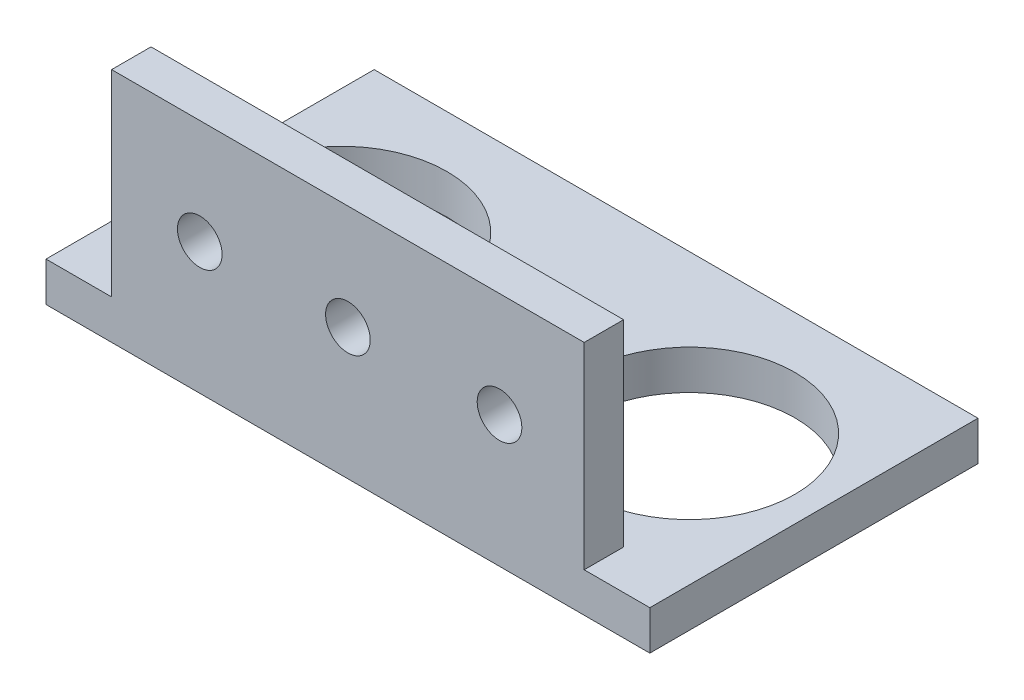
ISO-10303-21;
HEADER;
FILE_DESCRIPTION(('STEP AP214'),'2;1');
FILE_NAME('part.step','',(''),(''),'','','');
FILE_SCHEMA(('AUTOMOTIVE_DESIGN { 1 0 10303 214 1 1 1 1 }'));
ENDSEC;
DATA;
#1=APPLICATION_CONTEXT('core data for automotive mechanical design processes');
#2=APPLICATION_PROTOCOL_DEFINITION('international standard','automotive_design',2000,#1);
#3=PRODUCT_CONTEXT('',#1,'mechanical');
#4=PRODUCT('Part','Part','',(#3));
#5=PRODUCT_RELATED_PRODUCT_CATEGORY('part','',(#4));
#6=PRODUCT_DEFINITION_FORMATION('','',#4);
#7=PRODUCT_DEFINITION_CONTEXT('part definition',#1,'design');
#8=PRODUCT_DEFINITION('design','',#6,#7);
#9=PRODUCT_DEFINITION_SHAPE('','',#8);
#10=(LENGTH_UNIT() NAMED_UNIT(*) SI_UNIT(.MILLI.,.METRE.));
#11=(NAMED_UNIT(*) PLANE_ANGLE_UNIT() SI_UNIT($,.RADIAN.));
#12=(NAMED_UNIT(*) SI_UNIT($,.STERADIAN.) SOLID_ANGLE_UNIT());
#13=UNCERTAINTY_MEASURE_WITH_UNIT(LENGTH_MEASURE(1.E-05),#10,'distance_accuracy_value','');
#14=(GEOMETRIC_REPRESENTATION_CONTEXT(3) GLOBAL_UNCERTAINTY_ASSIGNED_CONTEXT((#13)) GLOBAL_UNIT_ASSIGNED_CONTEXT((#10,
#11,#12)) REPRESENTATION_CONTEXT('',''));
#15=CARTESIAN_POINT('',(0.,0.,0.));
#16=DIRECTION('',(0.,0.,1.));
#17=DIRECTION('',(1.,0.,0.));
#18=AXIS2_PLACEMENT_3D('',#15,#16,#17);
#19=CARTESIAN_POINT('',(-23.,18.,9.5));
#20=DIRECTION('',(0.,0.,1.));
#21=DIRECTION('',(1.,0.,0.));
#22=AXIS2_PLACEMENT_3D('',#19,#20,#21);
#23=PLANE('',#22);
#24=CARTESIAN_POINT('',(11.5475406188479,10.0060357357329,9.5));
#25=DIRECTION('',(0.,0.,-1.));
#26=DIRECTION('',(-1.,0.,0.));
#27=AXIS2_PLACEMENT_3D('',#24,#25,#26);
#28=CIRCLE('',#27,1.725);
#29=CARTESIAN_POINT('',(9.8225406188479,10.0060357357329,9.5));
#30=VERTEX_POINT('',#29);
#31=EDGE_CURVE('E209',#30,#30,#28,.T.);
#32=ORIENTED_EDGE('',*,*,#31,.F.);
#33=EDGE_LOOP('',(#32));
#34=FACE_BOUND('',#33,.T.);
#35=CARTESIAN_POINT('',(0.,10.0060357357329,9.5));
#36=DIRECTION('',(0.,0.,-1.));
#37=DIRECTION('',(-1.,0.,0.));
#38=AXIS2_PLACEMENT_3D('',#35,#36,#37);
#39=CIRCLE('',#38,1.725);
#40=CARTESIAN_POINT('',(-1.725,10.0060357357329,9.5));
#41=VERTEX_POINT('',#40);
#42=EDGE_CURVE('E221',#41,#41,#39,.T.);
#43=ORIENTED_EDGE('',*,*,#42,.F.);
#44=EDGE_LOOP('',(#43));
#45=FACE_BOUND('',#44,.T.);
#46=CARTESIAN_POINT('',(-11.2850965138741,10.0060357357329,9.5));
#47=DIRECTION('',(0.,0.,-1.));
#48=DIRECTION('',(-1.,0.,0.));
#49=AXIS2_PLACEMENT_3D('',#46,#47,#48);
#50=CIRCLE('',#49,1.725);
#51=CARTESIAN_POINT('',(-13.0100965138741,10.0060357357329,9.5));
#52=VERTEX_POINT('',#51);
#53=EDGE_CURVE('E233',#52,#52,#50,.T.);
#54=ORIENTED_EDGE('',*,*,#53,.F.);
#55=EDGE_LOOP('',(#54));
#56=FACE_BOUND('',#55,.T.);
#57=DIRECTION('',(0.,-1.,0.));
#58=VECTOR('',#57,1.);
#59=CARTESIAN_POINT('',(18.,18.,9.5));
#60=LINE('',#59,#58);
#61=CARTESIAN_POINT('',(18.,18.,9.5));
#62=VERTEX_POINT('',#61);
#63=CARTESIAN_POINT('',(18.,3.,9.5));
#64=VERTEX_POINT('',#63);
#65=EDGE_CURVE('E250',#62,#64,#60,.T.);
#66=ORIENTED_EDGE('',*,*,#65,.T.);
#67=DIRECTION('',(-1.,0.,0.));
#68=VECTOR('',#67,1.);
#69=CARTESIAN_POINT('',(-23.,3.,9.5));
#70=LINE('',#69,#68);
#71=CARTESIAN_POINT('',(-18.,3.,9.5));
#72=VERTEX_POINT('',#71);
#73=EDGE_CURVE('E266',#64,#72,#70,.T.);
#74=ORIENTED_EDGE('',*,*,#73,.T.);
#75=DIRECTION('',(0.,-1.,0.));
#76=VECTOR('',#75,1.);
#77=CARTESIAN_POINT('',(-18.,18.,9.5));
#78=LINE('',#77,#76);
#79=CARTESIAN_POINT('',(-18.,18.,9.5));
#80=VERTEX_POINT('',#79);
#81=EDGE_CURVE('E270',#80,#72,#78,.T.);
#82=ORIENTED_EDGE('',*,*,#81,.F.);
#83=DIRECTION('',(-1.,0.,0.));
#84=VECTOR('',#83,1.);
#85=CARTESIAN_POINT('',(-23.,18.,9.5));
#86=LINE('',#85,#84);
#87=EDGE_CURVE('E285',#62,#80,#86,.T.);
#88=ORIENTED_EDGE('',*,*,#87,.F.);
#89=EDGE_LOOP('',(#66,#74,#82,#88));
#90=FACE_BOUND('',#89,.T.);
#91=ADVANCED_FACE('F75',(#34,#45,#56,#90),#23,.F.);
#92=CARTESIAN_POINT('',(0.,18.,0.));
#93=DIRECTION('',(0.,-1.,0.));
#94=DIRECTION('',(0.,0.,-1.));
#95=AXIS2_PLACEMENT_3D('',#92,#93,#94);
#96=PLANE('',#95);
#97=DIRECTION('',(0.,0.,-1.));
#98=VECTOR('',#97,1.);
#99=CARTESIAN_POINT('',(18.,18.,12.501));
#100=LINE('',#99,#98);
#101=CARTESIAN_POINT('',(18.,18.,12.5));
#102=VERTEX_POINT('',#101);
#103=EDGE_CURVE('E256',#102,#62,#100,.T.);
#104=ORIENTED_EDGE('',*,*,#103,.T.);
#105=ORIENTED_EDGE('',*,*,#87,.T.);
#106=DIRECTION('',(0.,0.,-1.));
#107=VECTOR('',#106,1.);
#108=CARTESIAN_POINT('',(-18.,18.,12.501));
#109=LINE('',#108,#107);
#110=CARTESIAN_POINT('',(-18.,18.,12.5));
#111=VERTEX_POINT('',#110);
#112=EDGE_CURVE('E267',#111,#80,#109,.T.);
#113=ORIENTED_EDGE('',*,*,#112,.F.);
#114=DIRECTION('',(1.,0.,0.));
#115=VECTOR('',#114,1.);
#116=CARTESIAN_POINT('',(-23.,18.,12.5));
#117=LINE('',#116,#115);
#118=EDGE_CURVE('E281',#111,#102,#117,.T.);
#119=ORIENTED_EDGE('',*,*,#118,.T.);
#120=EDGE_LOOP('',(#104,#105,#113,#119));
#121=FACE_BOUND('',#120,.T.);
#122=ADVANCED_FACE('F354',(#121),#96,.F.);
#123=CARTESIAN_POINT('',(0.,3.,0.));
#124=DIRECTION('',(0.,-1.,0.));
#125=DIRECTION('',(0.,0.,-1.));
#126=AXIS2_PLACEMENT_3D('',#123,#124,#125);
#127=PLANE('',#126);
#128=CARTESIAN_POINT('',(13.,3.,-0.500000000000002));
#129=DIRECTION('',(0.,-1.,0.));
#130=DIRECTION('',(0.,0.,-1.));
#131=AXIS2_PLACEMENT_3D('',#128,#129,#130);
#132=CIRCLE('',#131,8.05);
#133=CARTESIAN_POINT('',(13.,3.,-8.55));
#134=VERTEX_POINT('',#133);
#135=EDGE_CURVE('E190',#134,#134,#132,.F.);
#136=ORIENTED_EDGE('',*,*,#135,.F.);
#137=EDGE_LOOP('',(#136));
#138=FACE_BOUND('',#137,.T.);
#139=DIRECTION('',(-1.,0.,0.));
#140=VECTOR('',#139,1.);
#141=CARTESIAN_POINT('',(-6.5,3.,9.3));
#142=LINE('',#141,#140);
#143=CARTESIAN_POINT('',(5.5,3.,9.3));
#144=VERTEX_POINT('',#143);
#145=CARTESIAN_POINT('',(-6.5,3.,9.3));
#146=VERTEX_POINT('',#145);
#147=EDGE_CURVE('E169',#144,#146,#142,.T.);
#148=ORIENTED_EDGE('',*,*,#147,.T.);
#149=DIRECTION('',(0.,0.,1.));
#150=VECTOR('',#149,1.);
#151=CARTESIAN_POINT('',(-6.5,3.,9.3));
#152=LINE('',#151,#150);
#153=CARTESIAN_POINT('',(-6.5,3.,5.3));
#154=VERTEX_POINT('',#153);
#155=EDGE_CURVE('E177',#154,#146,#152,.T.);
#156=ORIENTED_EDGE('',*,*,#155,.F.);
#157=DIRECTION('',(-1.,0.,0.));
#158=VECTOR('',#157,1.);
#159=CARTESIAN_POINT('',(-6.5,3.,5.3));
#160=LINE('',#159,#158);
#161=CARTESIAN_POINT('',(5.5,3.,5.3));
#162=VERTEX_POINT('',#161);
#163=EDGE_CURVE('E174',#162,#154,#160,.T.);
#164=ORIENTED_EDGE('',*,*,#163,.F.);
#165=DIRECTION('',(0.,0.,1.));
#166=VECTOR('',#165,1.);
#167=CARTESIAN_POINT('',(5.5,3.,9.3));
#168=LINE('',#167,#166);
#169=EDGE_CURVE('E91',#162,#144,#168,.T.);
#170=ORIENTED_EDGE('',*,*,#169,.T.);
#171=EDGE_LOOP('',(#148,#156,#164,#170));
#172=FACE_BOUND('',#171,.T.);
#173=CARTESIAN_POINT('',(-13.5,3.,-0.500000000000002));
#174=DIRECTION('',(0.,-1.,0.));
#175=DIRECTION('',(0.,0.,-1.));
#176=AXIS2_PLACEMENT_3D('',#173,#174,#175);
#177=CIRCLE('',#176,8.05);
#178=CARTESIAN_POINT('',(-13.5,3.,-8.55));
#179=VERTEX_POINT('',#178);
#180=EDGE_CURVE('E205',#179,#179,#177,.F.);
#181=ORIENTED_EDGE('',*,*,#180,.F.);
#182=EDGE_LOOP('',(#181));
#183=FACE_BOUND('',#182,.T.);
#184=ORIENTED_EDGE('',*,*,#73,.F.);
#185=DIRECTION('',(0.,0.,-1.));
#186=VECTOR('',#185,1.);
#187=CARTESIAN_POINT('',(18.,3.,12.501));
#188=LINE('',#187,#186);
#189=CARTESIAN_POINT('',(18.,3.,12.5));
#190=VERTEX_POINT('',#189);
#191=EDGE_CURVE('E255',#190,#64,#188,.T.);
#192=ORIENTED_EDGE('',*,*,#191,.F.);
#193=DIRECTION('',(1.,0.,0.));
#194=VECTOR('',#193,1.);
#195=CARTESIAN_POINT('',(23.,3.,12.5));
#196=LINE('',#195,#194);
#197=CARTESIAN_POINT('',(23.,3.,12.5));
#198=VERTEX_POINT('',#197);
#199=EDGE_CURVE('E246',#190,#198,#196,.T.);
#200=ORIENTED_EDGE('',*,*,#199,.T.);
#201=DIRECTION('',(0.,0.,-1.));
#202=VECTOR('',#201,1.);
#203=CARTESIAN_POINT('',(23.,3.,12.5));
#204=LINE('',#203,#202);
#205=CARTESIAN_POINT('',(23.,3.,-12.5));
#206=VERTEX_POINT('',#205);
#207=EDGE_CURVE('E293',#198,#206,#204,.T.);
#208=ORIENTED_EDGE('',*,*,#207,.T.);
#209=DIRECTION('',(-1.,0.,0.));
#210=VECTOR('',#209,1.);
#211=CARTESIAN_POINT('',(-23.,3.,-12.5));
#212=LINE('',#211,#210);
#213=CARTESIAN_POINT('',(-23.,3.,-12.5));
#214=VERTEX_POINT('',#213);
#215=EDGE_CURVE('E296',#206,#214,#212,.T.);
#216=ORIENTED_EDGE('',*,*,#215,.T.);
#217=DIRECTION('',(0.,0.,1.));
#218=VECTOR('',#217,1.);
#219=CARTESIAN_POINT('',(-23.,3.,12.5));
#220=LINE('',#219,#218);
#221=CARTESIAN_POINT('',(-23.,3.,12.5));
#222=VERTEX_POINT('',#221);
#223=EDGE_CURVE('E300',#214,#222,#220,.T.);
#224=ORIENTED_EDGE('',*,*,#223,.T.);
#225=DIRECTION('',(1.,0.,0.));
#226=VECTOR('',#225,1.);
#227=CARTESIAN_POINT('',(-18.,3.,12.5));
#228=LINE('',#227,#226);
#229=CARTESIAN_POINT('',(-18.,3.,12.5));
#230=VERTEX_POINT('',#229);
#231=EDGE_CURVE('E276',#222,#230,#228,.T.);
#232=ORIENTED_EDGE('',*,*,#231,.T.);
#233=DIRECTION('',(0.,0.,-1.));
#234=VECTOR('',#233,1.);
#235=CARTESIAN_POINT('',(-18.,3.,12.501));
#236=LINE('',#235,#234);
#237=EDGE_CURVE('E245',#230,#72,#236,.T.);
#238=ORIENTED_EDGE('',*,*,#237,.T.);
#239=EDGE_LOOP('',(#184,#192,#200,#208,#216,#224,#232,#238));
#240=FACE_BOUND('',#239,.T.);
#241=ADVANCED_FACE('F185',(#138,#172,#183,#240),#127,.F.);
#242=CARTESIAN_POINT('',(23.,3.,12.5));
#243=DIRECTION('',(-1.,0.,0.));
#244=DIRECTION('',(0.,0.,1.));
#245=AXIS2_PLACEMENT_3D('',#242,#243,#244);
#246=PLANE('',#245);
#247=ORIENTED_EDGE('',*,*,#207,.F.);
#248=DIRECTION('',(0.,-1.,0.));
#249=VECTOR('',#248,1.);
#250=CARTESIAN_POINT('',(23.,3.,12.5));
#251=LINE('',#250,#249);
#252=CARTESIAN_POINT('',(23.,0.,12.5));
#253=VERTEX_POINT('',#252);
#254=EDGE_CURVE('E303',#198,#253,#251,.T.);
#255=ORIENTED_EDGE('',*,*,#254,.T.);
#256=DIRECTION('',(0.,0.,-1.));
#257=VECTOR('',#256,1.);
#258=CARTESIAN_POINT('',(23.,0.,12.5));
#259=LINE('',#258,#257);
#260=CARTESIAN_POINT('',(23.,0.,-12.5));
#261=VERTEX_POINT('',#260);
#262=EDGE_CURVE('E289',#253,#261,#259,.T.);
#263=ORIENTED_EDGE('',*,*,#262,.T.);
#264=DIRECTION('',(0.,-1.,0.));
#265=VECTOR('',#264,1.);
#266=CARTESIAN_POINT('',(23.,3.,-12.5));
#267=LINE('',#266,#265);
#268=EDGE_CURVE('E12',#206,#261,#267,.T.);
#269=ORIENTED_EDGE('',*,*,#268,.F.);
#270=EDGE_LOOP('',(#247,#255,#263,#269));
#271=FACE_BOUND('',#270,.T.);
#272=ADVANCED_FACE('F77',(#271),#246,.F.);
#273=CARTESIAN_POINT('',(-23.,3.,-12.5));
#274=DIRECTION('',(0.,0.,1.));
#275=DIRECTION('',(1.,0.,0.));
#276=AXIS2_PLACEMENT_3D('',#273,#274,#275);
#277=PLANE('',#276);
#278=DIRECTION('',(-1.,0.,0.));
#279=VECTOR('',#278,1.);
#280=CARTESIAN_POINT('',(-23.,0.,-12.5));
#281=LINE('',#280,#279);
#282=CARTESIAN_POINT('',(-23.,0.,-12.5));
#283=VERTEX_POINT('',#282);
#284=EDGE_CURVE('E307',#261,#283,#281,.T.);
#285=ORIENTED_EDGE('',*,*,#284,.T.);
#286=DIRECTION('',(0.,-1.,0.));
#287=VECTOR('',#286,1.);
#288=CARTESIAN_POINT('',(-23.,3.,-12.5));
#289=LINE('',#288,#287);
#290=EDGE_CURVE('E84',#214,#283,#289,.T.);
#291=ORIENTED_EDGE('',*,*,#290,.F.);
#292=ORIENTED_EDGE('',*,*,#215,.F.);
#293=ORIENTED_EDGE('',*,*,#268,.T.);
#294=EDGE_LOOP('',(#285,#291,#292,#293));
#295=FACE_BOUND('',#294,.T.);
#296=ADVANCED_FACE('F387',(#295),#277,.F.);
#297=CARTESIAN_POINT('',(-23.,3.,12.5));
#298=DIRECTION('',(1.,0.,0.));
#299=DIRECTION('',(0.,0.,-1.));
#300=AXIS2_PLACEMENT_3D('',#297,#298,#299);
#301=PLANE('',#300);
#302=DIRECTION('',(0.,-1.,0.));
#303=VECTOR('',#302,1.);
#304=CARTESIAN_POINT('',(-23.,3.,12.5));
#305=LINE('',#304,#303);
#306=CARTESIAN_POINT('',(-23.,0.,12.5));
#307=VERTEX_POINT('',#306);
#308=EDGE_CURVE('E319',#222,#307,#305,.T.);
#309=ORIENTED_EDGE('',*,*,#308,.F.);
#310=ORIENTED_EDGE('',*,*,#223,.F.);
#311=ORIENTED_EDGE('',*,*,#290,.T.);
#312=DIRECTION('',(0.,0.,1.));
#313=VECTOR('',#312,1.);
#314=CARTESIAN_POINT('',(-23.,0.,12.5));
#315=LINE('',#314,#313);
#316=EDGE_CURVE('E310',#283,#307,#315,.T.);
#317=ORIENTED_EDGE('',*,*,#316,.T.);
#318=EDGE_LOOP('',(#309,#310,#311,#317));
#319=FACE_BOUND('',#318,.T.);
#320=ADVANCED_FACE('F328',(#319),#301,.F.);
#321=CARTESIAN_POINT('',(-23.,3.,12.5));
#322=DIRECTION('',(0.,0.,-1.));
#323=DIRECTION('',(-1.,0.,0.));
#324=AXIS2_PLACEMENT_3D('',#321,#322,#323);
#325=PLANE('',#324);
#326=CARTESIAN_POINT('',(11.5475406188479,10.0060357357329,12.5));
#327=DIRECTION('',(0.,0.,-1.));
#328=DIRECTION('',(-1.,0.,0.));
#329=AXIS2_PLACEMENT_3D('',#326,#327,#328);
#330=CIRCLE('',#329,1.7);
#331=CARTESIAN_POINT('',(9.8475406188479,10.0060357357329,12.5));
#332=VERTEX_POINT('',#331);
#333=EDGE_CURVE('E217',#332,#332,#330,.T.);
#334=ORIENTED_EDGE('',*,*,#333,.T.);
#335=EDGE_LOOP('',(#334));
#336=FACE_BOUND('',#335,.T.);
#337=CARTESIAN_POINT('',(0.,10.0060357357329,12.5));
#338=DIRECTION('',(0.,0.,-1.));
#339=DIRECTION('',(-1.,0.,0.));
#340=AXIS2_PLACEMENT_3D('',#337,#338,#339);
#341=CIRCLE('',#340,1.7);
#342=CARTESIAN_POINT('',(-1.7,10.0060357357329,12.5));
#343=VERTEX_POINT('',#342);
#344=EDGE_CURVE('E229',#343,#343,#341,.T.);
#345=ORIENTED_EDGE('',*,*,#344,.T.);
#346=EDGE_LOOP('',(#345));
#347=FACE_BOUND('',#346,.T.);
#348=CARTESIAN_POINT('',(-11.2850965138741,10.0060357357329,12.5));
#349=DIRECTION('',(0.,0.,-1.));
#350=DIRECTION('',(-1.,0.,0.));
#351=AXIS2_PLACEMENT_3D('',#348,#349,#350);
#352=CIRCLE('',#351,1.7);
#353=CARTESIAN_POINT('',(-12.9850965138741,10.0060357357329,12.5));
#354=VERTEX_POINT('',#353);
#355=EDGE_CURVE('E241',#354,#354,#352,.T.);
#356=ORIENTED_EDGE('',*,*,#355,.T.);
#357=EDGE_LOOP('',(#356));
#358=FACE_BOUND('',#357,.T.);
#359=ORIENTED_EDGE('',*,*,#254,.F.);
#360=ORIENTED_EDGE('',*,*,#199,.F.);
#361=DIRECTION('',(0.,1.,0.));
#362=VECTOR('',#361,1.);
#363=CARTESIAN_POINT('',(18.,18.,12.5));
#364=LINE('',#363,#362);
#365=EDGE_CURVE('E260',#190,#102,#364,.T.);
#366=ORIENTED_EDGE('',*,*,#365,.T.);
#367=ORIENTED_EDGE('',*,*,#118,.F.);
#368=DIRECTION('',(0.,1.,0.));
#369=VECTOR('',#368,1.);
#370=CARTESIAN_POINT('',(-18.,18.,12.5));
#371=LINE('',#370,#369);
#372=EDGE_CURVE('E251',#230,#111,#371,.T.);
#373=ORIENTED_EDGE('',*,*,#372,.F.);
#374=ORIENTED_EDGE('',*,*,#231,.F.);
#375=ORIENTED_EDGE('',*,*,#308,.T.);
#376=DIRECTION('',(1.,0.,0.));
#377=VECTOR('',#376,1.);
#378=CARTESIAN_POINT('',(-23.,0.,12.5));
#379=LINE('',#378,#377);
#380=EDGE_CURVE('E297',#307,#253,#379,.T.);
#381=ORIENTED_EDGE('',*,*,#380,.T.);
#382=EDGE_LOOP('',(#359,#360,#366,#367,#373,#374,#375,#381));
#383=FACE_BOUND('',#382,.T.);
#384=ADVANCED_FACE('F337',(#336,#347,#358,#383),#325,.F.);
#385=CARTESIAN_POINT('',(0.,0.,0.));
#386=DIRECTION('',(0.,-1.,0.));
#387=DIRECTION('',(0.,0.,-1.));
#388=AXIS2_PLACEMENT_3D('',#385,#386,#387);
#389=PLANE('',#388);
#390=CARTESIAN_POINT('',(13.,0.,-0.500000000000002));
#391=DIRECTION('',(0.,-1.,0.));
#392=DIRECTION('',(0.,0.,-1.));
#393=AXIS2_PLACEMENT_3D('',#390,#391,#392);
#394=CIRCLE('',#393,8.05);
#395=CARTESIAN_POINT('',(13.,0.,-8.55));
#396=VERTEX_POINT('',#395);
#397=EDGE_CURVE('E197',#396,#396,#394,.T.);
#398=ORIENTED_EDGE('',*,*,#397,.F.);
#399=EDGE_LOOP('',(#398));
#400=FACE_BOUND('',#399,.T.);
#401=DIRECTION('',(0.,0.,-1.));
#402=VECTOR('',#401,1.);
#403=CARTESIAN_POINT('',(-6.5,0.,9.3));
#404=LINE('',#403,#402);
#405=CARTESIAN_POINT('',(-6.5,0.,9.3));
#406=VERTEX_POINT('',#405);
#407=CARTESIAN_POINT('',(-6.5,0.,5.3));
#408=VERTEX_POINT('',#407);
#409=EDGE_CURVE('E99',#406,#408,#404,.T.);
#410=ORIENTED_EDGE('',*,*,#409,.F.);
#411=DIRECTION('',(1.,0.,0.));
#412=VECTOR('',#411,1.);
#413=CARTESIAN_POINT('',(-6.5,0.,9.3));
#414=LINE('',#413,#412);
#415=CARTESIAN_POINT('',(5.5,0.,9.3));
#416=VERTEX_POINT('',#415);
#417=EDGE_CURVE('E171',#406,#416,#414,.T.);
#418=ORIENTED_EDGE('',*,*,#417,.T.);
#419=DIRECTION('',(0.,0.,-1.));
#420=VECTOR('',#419,1.);
#421=CARTESIAN_POINT('',(5.5,0.,9.3));
#422=LINE('',#421,#420);
#423=CARTESIAN_POINT('',(5.5,0.,5.3));
#424=VERTEX_POINT('',#423);
#425=EDGE_CURVE('E546',#416,#424,#422,.T.);
#426=ORIENTED_EDGE('',*,*,#425,.T.);
#427=DIRECTION('',(1.,0.,0.));
#428=VECTOR('',#427,1.);
#429=CARTESIAN_POINT('',(-6.5,0.,5.3));
#430=LINE('',#429,#428);
#431=EDGE_CURVE('E543',#408,#424,#430,.T.);
#432=ORIENTED_EDGE('',*,*,#431,.F.);
#433=EDGE_LOOP('',(#410,#418,#426,#432));
#434=FACE_BOUND('',#433,.T.);
#435=CARTESIAN_POINT('',(-13.5,0.,-0.500000000000002));
#436=DIRECTION('',(0.,-1.,0.));
#437=DIRECTION('',(0.,0.,-1.));
#438=AXIS2_PLACEMENT_3D('',#435,#436,#437);
#439=CIRCLE('',#438,8.05);
#440=CARTESIAN_POINT('',(-13.5,0.,-8.55));
#441=VERTEX_POINT('',#440);
#442=EDGE_CURVE('E201',#441,#441,#439,.T.);
#443=ORIENTED_EDGE('',*,*,#442,.F.);
#444=EDGE_LOOP('',(#443));
#445=FACE_BOUND('',#444,.T.);
#446=ORIENTED_EDGE('',*,*,#262,.F.);
#447=ORIENTED_EDGE('',*,*,#380,.F.);
#448=ORIENTED_EDGE('',*,*,#316,.F.);
#449=ORIENTED_EDGE('',*,*,#284,.F.);
#450=EDGE_LOOP('',(#446,#447,#448,#449));
#451=FACE_BOUND('',#450,.T.);
#452=ADVANCED_FACE('F334',(#400,#434,#445,#451),#389,.T.);
#453=CARTESIAN_POINT('',(-18.,18.,12.501));
#454=DIRECTION('',(1.,0.,0.));
#455=DIRECTION('',(0.,1.,0.));
#456=AXIS2_PLACEMENT_3D('',#453,#454,#455);
#457=PLANE('',#456);
#458=ORIENTED_EDGE('',*,*,#372,.T.);
#459=ORIENTED_EDGE('',*,*,#112,.T.);
#460=ORIENTED_EDGE('',*,*,#81,.T.);
#461=ORIENTED_EDGE('',*,*,#237,.F.);
#462=EDGE_LOOP('',(#458,#459,#460,#461));
#463=FACE_BOUND('',#462,.T.);
#464=ADVANCED_FACE('F346',(#463),#457,.F.);
#465=CARTESIAN_POINT('',(18.,18.,12.501));
#466=DIRECTION('',(1.,0.,0.));
#467=DIRECTION('',(0.,0.,-1.));
#468=AXIS2_PLACEMENT_3D('',#465,#466,#467);
#469=PLANE('',#468);
#470=ORIENTED_EDGE('',*,*,#191,.T.);
#471=ORIENTED_EDGE('',*,*,#65,.F.);
#472=ORIENTED_EDGE('',*,*,#103,.F.);
#473=ORIENTED_EDGE('',*,*,#365,.F.);
#474=EDGE_LOOP('',(#470,#471,#472,#473));
#475=FACE_BOUND('',#474,.T.);
#476=ADVANCED_FACE('F355',(#475),#469,.T.);
#477=CARTESIAN_POINT('',(-11.2850965138741,10.0060357357329,9.5));
#478=DIRECTION('',(0.,0.,-1.));
#479=DIRECTION('',(-1.,0.,0.));
#480=AXIS2_PLACEMENT_3D('',#477,#478,#479);
#481=CYLINDRICAL_SURFACE('',#480,1.69999999999999);
#482=ORIENTED_EDGE('',*,*,#355,.F.);
#483=EDGE_LOOP('',(#482));
#484=FACE_BOUND('',#483,.T.);
#485=CARTESIAN_POINT('',(-11.2850965138741,10.0060357357329,9.52500000000002));
#486=DIRECTION('',(0.,0.,-1.));
#487=DIRECTION('',(-1.,0.,0.));
#488=AXIS2_PLACEMENT_3D('',#485,#486,#487);
#489=CIRCLE('',#488,1.69999999999999);
#490=CARTESIAN_POINT('',(-12.9850965138741,10.0060357357329,9.52500000000002));
#491=VERTEX_POINT('',#490);
#492=EDGE_CURVE('E237',#491,#491,#489,.T.);
#493=ORIENTED_EDGE('',*,*,#492,.T.);
#494=EDGE_LOOP('',(#493));
#495=FACE_BOUND('',#494,.T.);
#496=ADVANCED_FACE('F357',(#484,#495),#481,.F.);
#497=CARTESIAN_POINT('',(-11.2850965138741,10.0060357357329,9.5));
#498=DIRECTION('',(0.,0.,-1.));
#499=DIRECTION('',(-1.,0.,0.));
#500=AXIS2_PLACEMENT_3D('',#497,#498,#499);
#501=CONICAL_SURFACE('',#500,1.725,0.785398163397171);
#502=ORIENTED_EDGE('',*,*,#492,.F.);
#503=EDGE_LOOP('',(#502));
#504=FACE_BOUND('',#503,.T.);
#505=ORIENTED_EDGE('',*,*,#53,.T.);
#506=EDGE_LOOP('',(#505));
#507=FACE_BOUND('',#506,.T.);
#508=ADVANCED_FACE('F364',(#504,#507),#501,.F.);
#509=CARTESIAN_POINT('',(0.,10.0060357357329,9.5));
#510=DIRECTION('',(0.,0.,-1.));
#511=DIRECTION('',(-1.,0.,0.));
#512=AXIS2_PLACEMENT_3D('',#509,#510,#511);
#513=CYLINDRICAL_SURFACE('',#512,1.69999999999999);
#514=ORIENTED_EDGE('',*,*,#344,.F.);
#515=EDGE_LOOP('',(#514));
#516=FACE_BOUND('',#515,.T.);
#517=CARTESIAN_POINT('',(0.,10.0060357357329,9.52500000000002));
#518=DIRECTION('',(0.,0.,-1.));
#519=DIRECTION('',(-1.,0.,0.));
#520=AXIS2_PLACEMENT_3D('',#517,#518,#519);
#521=CIRCLE('',#520,1.69999999999999);
#522=CARTESIAN_POINT('',(-1.69999999999999,10.0060357357329,9.52500000000002));
#523=VERTEX_POINT('',#522);
#524=EDGE_CURVE('E225',#523,#523,#521,.T.);
#525=ORIENTED_EDGE('',*,*,#524,.T.);
#526=EDGE_LOOP('',(#525));
#527=FACE_BOUND('',#526,.T.);
#528=ADVANCED_FACE('F434',(#516,#527),#513,.F.);
#529=CARTESIAN_POINT('',(0.,10.0060357357329,9.5));
#530=DIRECTION('',(0.,0.,-1.));
#531=DIRECTION('',(-1.,0.,0.));
#532=AXIS2_PLACEMENT_3D('',#529,#530,#531);
#533=CONICAL_SURFACE('',#532,1.725,0.785398163397171);
#534=ORIENTED_EDGE('',*,*,#524,.F.);
#535=EDGE_LOOP('',(#534));
#536=FACE_BOUND('',#535,.T.);
#537=ORIENTED_EDGE('',*,*,#42,.T.);
#538=EDGE_LOOP('',(#537));
#539=FACE_BOUND('',#538,.T.);
#540=ADVANCED_FACE('F444',(#536,#539),#533,.F.);
#541=CARTESIAN_POINT('',(11.5475406188479,10.0060357357329,9.5));
#542=DIRECTION('',(0.,0.,-1.));
#543=DIRECTION('',(-1.,0.,0.));
#544=AXIS2_PLACEMENT_3D('',#541,#542,#543);
#545=CYLINDRICAL_SURFACE('',#544,1.69999999999999);
#546=ORIENTED_EDGE('',*,*,#333,.F.);
#547=EDGE_LOOP('',(#546));
#548=FACE_BOUND('',#547,.T.);
#549=CARTESIAN_POINT('',(11.5475406188479,10.0060357357329,9.52500000000002));
#550=DIRECTION('',(0.,0.,-1.));
#551=DIRECTION('',(-1.,0.,0.));
#552=AXIS2_PLACEMENT_3D('',#549,#550,#551);
#553=CIRCLE('',#552,1.69999999999999);
#554=CARTESIAN_POINT('',(9.84754061884792,10.0060357357329,9.52500000000002));
#555=VERTEX_POINT('',#554);
#556=EDGE_CURVE('E213',#555,#555,#553,.T.);
#557=ORIENTED_EDGE('',*,*,#556,.T.);
#558=EDGE_LOOP('',(#557));
#559=FACE_BOUND('',#558,.T.);
#560=ADVANCED_FACE('F454',(#548,#559),#545,.F.);
#561=CARTESIAN_POINT('',(11.5475406188479,10.0060357357329,9.5));
#562=DIRECTION('',(0.,0.,-1.));
#563=DIRECTION('',(-1.,0.,0.));
#564=AXIS2_PLACEMENT_3D('',#561,#562,#563);
#565=CONICAL_SURFACE('',#564,1.725,0.785398163397171);
#566=ORIENTED_EDGE('',*,*,#556,.F.);
#567=EDGE_LOOP('',(#566));
#568=FACE_BOUND('',#567,.T.);
#569=ORIENTED_EDGE('',*,*,#31,.T.);
#570=EDGE_LOOP('',(#569));
#571=FACE_BOUND('',#570,.T.);
#572=ADVANCED_FACE('F464',(#568,#571),#565,.F.);
#573=CARTESIAN_POINT('',(-13.5,18.001,-0.500000000000002));
#574=DIRECTION('',(0.,-1.,0.));
#575=DIRECTION('',(0.,0.,-1.));
#576=AXIS2_PLACEMENT_3D('',#573,#574,#575);
#577=CYLINDRICAL_SURFACE('',#576,8.05);
#578=ORIENTED_EDGE('',*,*,#442,.T.);
#579=EDGE_LOOP('',(#578));
#580=FACE_BOUND('',#579,.T.);
#581=ORIENTED_EDGE('',*,*,#180,.T.);
#582=EDGE_LOOP('',(#581));
#583=FACE_BOUND('',#582,.T.);
#584=ADVANCED_FACE('F474',(#580,#583),#577,.F.);
#585=CARTESIAN_POINT('',(-6.5,18.001,9.3));
#586=DIRECTION('',(-1.,0.,0.));
#587=DIRECTION('',(0.,0.,1.));
#588=AXIS2_PLACEMENT_3D('',#585,#586,#587);
#589=PLANE('',#588);
#590=ORIENTED_EDGE('',*,*,#155,.T.);
#591=DIRECTION('',(0.,-1.,0.));
#592=VECTOR('',#591,1.);
#593=CARTESIAN_POINT('',(-6.5,18.001,9.3));
#594=LINE('',#593,#592);
#595=EDGE_CURVE('E165',#146,#406,#594,.T.);
#596=ORIENTED_EDGE('',*,*,#595,.T.);
#597=ORIENTED_EDGE('',*,*,#409,.T.);
#598=DIRECTION('',(0.,-1.,0.));
#599=VECTOR('',#598,1.);
#600=CARTESIAN_POINT('',(-6.5,18.001,5.3));
#601=LINE('',#600,#599);
#602=EDGE_CURVE('E179',#154,#408,#601,.T.);
#603=ORIENTED_EDGE('',*,*,#602,.F.);
#604=EDGE_LOOP('',(#590,#596,#597,#603));
#605=FACE_BOUND('',#604,.T.);
#606=ADVANCED_FACE('F178',(#605),#589,.F.);
#607=CARTESIAN_POINT('',(-6.5,18.001,9.3));
#608=DIRECTION('',(0.,0.,-1.));
#609=DIRECTION('',(-1.,0.,0.));
#610=AXIS2_PLACEMENT_3D('',#607,#608,#609);
#611=PLANE('',#610);
#612=DIRECTION('',(0.,-1.,0.));
#613=VECTOR('',#612,1.);
#614=CARTESIAN_POINT('',(5.5,18.001,9.3));
#615=LINE('',#614,#613);
#616=EDGE_CURVE('E173',#144,#416,#615,.T.);
#617=ORIENTED_EDGE('',*,*,#616,.T.);
#618=ORIENTED_EDGE('',*,*,#417,.F.);
#619=ORIENTED_EDGE('',*,*,#595,.F.);
#620=ORIENTED_EDGE('',*,*,#147,.F.);
#621=EDGE_LOOP('',(#617,#618,#619,#620));
#622=FACE_BOUND('',#621,.T.);
#623=ADVANCED_FACE('F167',(#622),#611,.T.);
#624=CARTESIAN_POINT('',(5.5,18.001,9.3));
#625=DIRECTION('',(-1.,0.,0.));
#626=DIRECTION('',(0.,0.,1.));
#627=AXIS2_PLACEMENT_3D('',#624,#625,#626);
#628=PLANE('',#627);
#629=DIRECTION('',(0.,-1.,0.));
#630=VECTOR('',#629,1.);
#631=CARTESIAN_POINT('',(5.5,18.001,5.3));
#632=LINE('',#631,#630);
#633=EDGE_CURVE('E555',#162,#424,#632,.T.);
#634=ORIENTED_EDGE('',*,*,#633,.T.);
#635=ORIENTED_EDGE('',*,*,#425,.F.);
#636=ORIENTED_EDGE('',*,*,#616,.F.);
#637=ORIENTED_EDGE('',*,*,#169,.F.);
#638=EDGE_LOOP('',(#634,#635,#636,#637));
#639=FACE_BOUND('',#638,.T.);
#640=ADVANCED_FACE('F501',(#639),#628,.T.);
#641=CARTESIAN_POINT('',(-6.5,18.001,5.3));
#642=DIRECTION('',(0.,0.,-1.));
#643=DIRECTION('',(-1.,0.,0.));
#644=AXIS2_PLACEMENT_3D('',#641,#642,#643);
#645=PLANE('',#644);
#646=ORIENTED_EDGE('',*,*,#163,.T.);
#647=ORIENTED_EDGE('',*,*,#602,.T.);
#648=ORIENTED_EDGE('',*,*,#431,.T.);
#649=ORIENTED_EDGE('',*,*,#633,.F.);
#650=EDGE_LOOP('',(#646,#647,#648,#649));
#651=FACE_BOUND('',#650,.T.);
#652=ADVANCED_FACE('F510',(#651),#645,.F.);
#653=CARTESIAN_POINT('',(13.,18.001,-0.500000000000002));
#654=DIRECTION('',(0.,-1.,0.));
#655=DIRECTION('',(0.,0.,-1.));
#656=AXIS2_PLACEMENT_3D('',#653,#654,#655);
#657=CYLINDRICAL_SURFACE('',#656,8.05);
#658=ORIENTED_EDGE('',*,*,#397,.T.);
#659=EDGE_LOOP('',(#658));
#660=FACE_BOUND('',#659,.T.);
#661=ORIENTED_EDGE('',*,*,#135,.T.);
#662=EDGE_LOOP('',(#661));
#663=FACE_BOUND('',#662,.T.);
#664=ADVANCED_FACE('F519',(#660,#663),#657,.F.);
#665=CLOSED_SHELL('',(#91,#122,#241,#272,#296,#320,#384,#452,#464,#476,#496,#508,#528,#540,#560,
#572,#584,#606,#623,#640,#652,#664));
#666=MANIFOLD_SOLID_BREP('B2',#665);
#667=ADVANCED_BREP_SHAPE_REPRESENTATION('',(#18,#666),#14);
#668=SHAPE_DEFINITION_REPRESENTATION(#9,#667);
ENDSEC;
END-ISO-10303-21;
